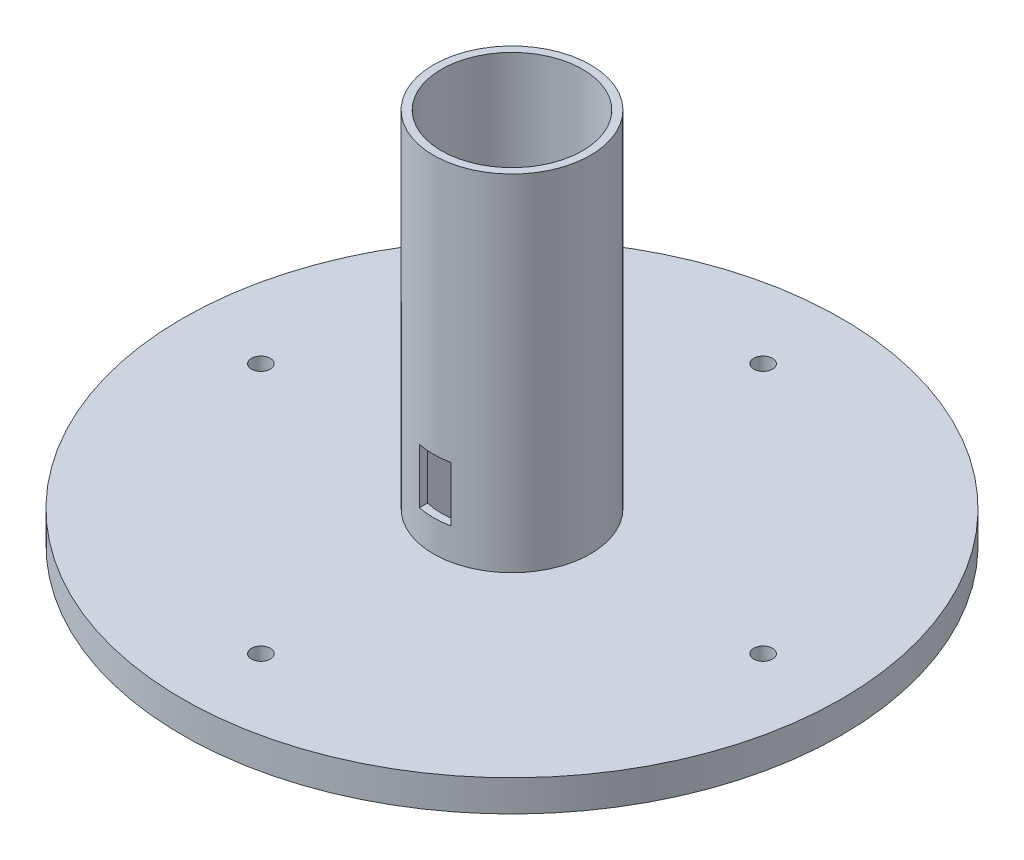
ISO-10303-21;
HEADER;
FILE_DESCRIPTION(('STEP AP214'),'2;1');
FILE_NAME('part.step','',(''),(''),'','','');
FILE_SCHEMA(('AUTOMOTIVE_DESIGN { 1 0 10303 214 1 1 1 1 }'));
ENDSEC;
DATA;
#1=APPLICATION_CONTEXT('core data for automotive mechanical design processes');
#2=APPLICATION_PROTOCOL_DEFINITION('international standard','automotive_design',2000,#1);
#3=PRODUCT_CONTEXT('',#1,'mechanical');
#4=PRODUCT('Part','Part','',(#3));
#5=PRODUCT_RELATED_PRODUCT_CATEGORY('part','',(#4));
#6=PRODUCT_DEFINITION_FORMATION('','',#4);
#7=PRODUCT_DEFINITION_CONTEXT('part definition',#1,'design');
#8=PRODUCT_DEFINITION('design','',#6,#7);
#9=PRODUCT_DEFINITION_SHAPE('','',#8);
#10=(LENGTH_UNIT() NAMED_UNIT(*) SI_UNIT(.MILLI.,.METRE.));
#11=(NAMED_UNIT(*) PLANE_ANGLE_UNIT() SI_UNIT($,.RADIAN.));
#12=(NAMED_UNIT(*) SI_UNIT($,.STERADIAN.) SOLID_ANGLE_UNIT());
#13=UNCERTAINTY_MEASURE_WITH_UNIT(LENGTH_MEASURE(1.E-05),#10,'distance_accuracy_value','');
#14=(GEOMETRIC_REPRESENTATION_CONTEXT(3) GLOBAL_UNCERTAINTY_ASSIGNED_CONTEXT((#13)) GLOBAL_UNIT_ASSIGNED_CONTEXT((#10,
#11,#12)) REPRESENTATION_CONTEXT('',''));
#15=CARTESIAN_POINT('',(0.,0.,0.));
#16=DIRECTION('',(0.,0.,1.));
#17=DIRECTION('',(1.,0.,0.));
#18=AXIS2_PLACEMENT_3D('',#15,#16,#17);
#19=CARTESIAN_POINT('',(31.75,-114.3,0.));
#20=DIRECTION('',(0.,-1.,0.));
#21=DIRECTION('',(1.,0.,0.));
#22=AXIS2_PLACEMENT_3D('',#19,#20,#21);
#23=PLANE('',#22);
#24=CARTESIAN_POINT('',(0.,-114.3,0.));
#25=DIRECTION('',(0.,-1.,0.));
#26=DIRECTION('',(1.,0.,0.));
#27=AXIS2_PLACEMENT_3D('',#24,#25,#26);
#28=CIRCLE('',#27,28.575);
#29=CARTESIAN_POINT('',(28.575,-114.3,0.));
#30=VERTEX_POINT('',#29);
#31=EDGE_CURVE('E119',#30,#30,#28,.T.);
#32=ORIENTED_EDGE('',*,*,#31,.T.);
#33=EDGE_LOOP('',(#32));
#34=FACE_BOUND('',#33,.T.);
#35=CARTESIAN_POINT('',(0.,-114.3,0.));
#36=DIRECTION('',(0.,1.,0.));
#37=DIRECTION('',(-1.,0.,0.));
#38=AXIS2_PLACEMENT_3D('',#35,#36,#37);
#39=CIRCLE('',#38,31.75);
#40=CARTESIAN_POINT('',(-31.75,-114.3,0.));
#41=VERTEX_POINT('',#40);
#42=EDGE_CURVE('E116',#41,#41,#39,.T.);
#43=ORIENTED_EDGE('',*,*,#42,.T.);
#44=EDGE_LOOP('',(#43));
#45=FACE_BOUND('',#44,.T.);
#46=ADVANCED_FACE('F41',(#34,#45),#23,.F.);
#47=CARTESIAN_POINT('',(0.,-279.4,0.));
#48=DIRECTION('',(0.,1.,0.));
#49=DIRECTION('',(-1.,0.,0.));
#50=AXIS2_PLACEMENT_3D('',#47,#48,#49);
#51=PLANE('',#50);
#52=CARTESIAN_POINT('',(0.,-279.4,0.));
#53=DIRECTION('',(0.,-1.,0.));
#54=DIRECTION('',(1.,0.,0.));
#55=AXIS2_PLACEMENT_3D('',#52,#53,#54);
#56=CIRCLE('',#55,28.575);
#57=CARTESIAN_POINT('',(28.575,-279.4,0.));
#58=VERTEX_POINT('',#57);
#59=EDGE_CURVE('E122',#58,#58,#56,.T.);
#60=ORIENTED_EDGE('',*,*,#59,.F.);
#61=EDGE_LOOP('',(#60));
#62=FACE_BOUND('',#61,.T.);
#63=CARTESIAN_POINT('',(0.,-279.4,0.));
#64=DIRECTION('',(0.,1.,0.));
#65=DIRECTION('',(-1.,0.,0.));
#66=AXIS2_PLACEMENT_3D('',#63,#64,#65);
#67=CIRCLE('',#66,31.75);
#68=CARTESIAN_POINT('',(-31.7499999999999,-279.4,0.));
#69=VERTEX_POINT('',#68);
#70=EDGE_CURVE('E84',#69,#69,#67,.T.);
#71=ORIENTED_EDGE('',*,*,#70,.F.);
#72=EDGE_LOOP('',(#71));
#73=FACE_BOUND('',#72,.T.);
#74=ADVANCED_FACE('F190',(#62,#73),#51,.F.);
#75=CARTESIAN_POINT('',(0.,0.,0.));
#76=DIRECTION('',(0.,1.,0.));
#77=DIRECTION('',(-1.,0.,0.));
#78=AXIS2_PLACEMENT_3D('',#75,#76,#77);
#79=CYLINDRICAL_SURFACE('',#78,31.75);
#80=CARTESIAN_POINT('',(0.,-266.7,0.));
#81=DIRECTION('',(0.,1.,0.));
#82=DIRECTION('',(-1.,0.,0.));
#83=AXIS2_PLACEMENT_3D('',#80,#81,#82);
#84=CIRCLE('',#83,31.75);
#85=CARTESIAN_POINT('',(-31.7499999999999,-266.7,0.));
#86=VERTEX_POINT('',#85);
#87=EDGE_CURVE('E104',#86,#86,#84,.T.);
#88=ORIENTED_EDGE('',*,*,#87,.F.);
#89=EDGE_LOOP('',(#88));
#90=FACE_BOUND('',#89,.T.);
#91=ORIENTED_EDGE('',*,*,#70,.T.);
#92=EDGE_LOOP('',(#91));
#93=FACE_BOUND('',#92,.T.);
#94=ADVANCED_FACE('F176',(#90,#93),#79,.T.);
#95=CARTESIAN_POINT('',(31.75,-266.7,0.));
#96=DIRECTION('',(0.,1.,0.));
#97=DIRECTION('',(-1.,0.,0.));
#98=AXIS2_PLACEMENT_3D('',#95,#96,#97);
#99=PLANE('',#98);
#100=CARTESIAN_POINT('',(0.,-266.7,101.6));
#101=DIRECTION('',(0.,-1.,0.));
#102=DIRECTION('',(1.,0.,0.));
#103=AXIS2_PLACEMENT_3D('',#100,#101,#102);
#104=CIRCLE('',#103,3.81);
#105=CARTESIAN_POINT('',(3.81000000000003,-266.7,101.6));
#106=VERTEX_POINT('',#105);
#107=EDGE_CURVE('E156',#106,#106,#104,.T.);
#108=ORIENTED_EDGE('',*,*,#107,.F.);
#109=EDGE_LOOP('',(#108));
#110=FACE_BOUND('',#109,.T.);
#111=CARTESIAN_POINT('',(101.6,-266.7,7.38124839028131E-13));
#112=DIRECTION('',(0.,-1.,0.));
#113=DIRECTION('',(1.,0.,0.));
#114=AXIS2_PLACEMENT_3D('',#111,#112,#113);
#115=CIRCLE('',#114,3.81);
#116=CARTESIAN_POINT('',(105.41,-266.7,7.38124839028131E-13));
#117=VERTEX_POINT('',#116);
#118=EDGE_CURVE('E153',#117,#117,#115,.T.);
#119=ORIENTED_EDGE('',*,*,#118,.F.);
#120=EDGE_LOOP('',(#119));
#121=FACE_BOUND('',#120,.T.);
#122=CARTESIAN_POINT('',(-3.02140300730264E-13,-266.7,-101.6));
#123=DIRECTION('',(0.,-1.,0.));
#124=DIRECTION('',(1.,0.,0.));
#125=AXIS2_PLACEMENT_3D('',#122,#123,#124);
#126=CIRCLE('',#125,3.81);
#127=CARTESIAN_POINT('',(3.8099999999997,-266.7,-101.6));
#128=VERTEX_POINT('',#127);
#129=EDGE_CURVE('E147',#128,#128,#126,.T.);
#130=ORIENTED_EDGE('',*,*,#129,.F.);
#131=EDGE_LOOP('',(#130));
#132=FACE_BOUND('',#131,.T.);
#133=CARTESIAN_POINT('',(-101.6,-266.7,0.));
#134=DIRECTION('',(0.,-1.,0.));
#135=DIRECTION('',(1.,0.,0.));
#136=AXIS2_PLACEMENT_3D('',#133,#134,#135);
#137=CIRCLE('',#136,3.81000000000001);
#138=CARTESIAN_POINT('',(-97.7900000000003,-266.7,0.));
#139=VERTEX_POINT('',#138);
#140=EDGE_CURVE('E141',#139,#139,#137,.T.);
#141=ORIENTED_EDGE('',*,*,#140,.F.);
#142=EDGE_LOOP('',(#141));
#143=FACE_BOUND('',#142,.T.);
#144=CARTESIAN_POINT('',(0.,-266.7,0.));
#145=DIRECTION('',(0.,1.,0.));
#146=DIRECTION('',(-1.,0.,0.));
#147=AXIS2_PLACEMENT_3D('',#144,#145,#146);
#148=CIRCLE('',#147,133.35);
#149=CARTESIAN_POINT('',(-133.35,-266.7,0.));
#150=VERTEX_POINT('',#149);
#151=EDGE_CURVE('E107',#150,#150,#148,.T.);
#152=ORIENTED_EDGE('',*,*,#151,.F.);
#153=EDGE_LOOP('',(#152));
#154=FACE_BOUND('',#153,.T.);
#155=ORIENTED_EDGE('',*,*,#87,.T.);
#156=EDGE_LOOP('',(#155));
#157=FACE_BOUND('',#156,.T.);
#158=ADVANCED_FACE('F172',(#110,#121,#132,#143,#154,#157),#99,.F.);
#159=CARTESIAN_POINT('',(0.,0.,0.));
#160=DIRECTION('',(0.,1.,0.));
#161=DIRECTION('',(-1.,0.,0.));
#162=AXIS2_PLACEMENT_3D('',#159,#160,#161);
#163=CYLINDRICAL_SURFACE('',#162,133.35);
#164=CARTESIAN_POINT('',(0.,-254.,0.));
#165=DIRECTION('',(0.,1.,0.));
#166=DIRECTION('',(-1.,0.,0.));
#167=AXIS2_PLACEMENT_3D('',#164,#165,#166);
#168=CIRCLE('',#167,133.35);
#169=CARTESIAN_POINT('',(-133.35,-254.,0.));
#170=VERTEX_POINT('',#169);
#171=EDGE_CURVE('E110',#170,#170,#168,.T.);
#172=ORIENTED_EDGE('',*,*,#171,.F.);
#173=EDGE_LOOP('',(#172));
#174=FACE_BOUND('',#173,.T.);
#175=ORIENTED_EDGE('',*,*,#151,.T.);
#176=EDGE_LOOP('',(#175));
#177=FACE_BOUND('',#176,.T.);
#178=ADVANCED_FACE('F175',(#174,#177),#163,.T.);
#179=CARTESIAN_POINT('',(31.75,-254.,0.));
#180=DIRECTION('',(0.,-1.,0.));
#181=DIRECTION('',(1.,0.,0.));
#182=AXIS2_PLACEMENT_3D('',#179,#180,#181);
#183=PLANE('',#182);
#184=CARTESIAN_POINT('',(0.,-254.,101.6));
#185=DIRECTION('',(0.,-1.,0.));
#186=DIRECTION('',(1.,0.,0.));
#187=AXIS2_PLACEMENT_3D('',#184,#185,#186);
#188=CIRCLE('',#187,3.81);
#189=CARTESIAN_POINT('',(3.81000000000003,-254.,101.6));
#190=VERTEX_POINT('',#189);
#191=EDGE_CURVE('E92',#190,#190,#188,.T.);
#192=ORIENTED_EDGE('',*,*,#191,.T.);
#193=EDGE_LOOP('',(#192));
#194=FACE_BOUND('',#193,.T.);
#195=CARTESIAN_POINT('',(101.6,-254.,7.38124839028131E-13));
#196=DIRECTION('',(0.,-1.,0.));
#197=DIRECTION('',(1.,0.,0.));
#198=AXIS2_PLACEMENT_3D('',#195,#196,#197);
#199=CIRCLE('',#198,3.81);
#200=CARTESIAN_POINT('',(105.41,-254.,7.38124839028131E-13));
#201=VERTEX_POINT('',#200);
#202=EDGE_CURVE('E150',#201,#201,#199,.T.);
#203=ORIENTED_EDGE('',*,*,#202,.T.);
#204=EDGE_LOOP('',(#203));
#205=FACE_BOUND('',#204,.T.);
#206=CARTESIAN_POINT('',(-3.03695602165181E-13,-254.,-101.6));
#207=DIRECTION('',(0.,-1.,0.));
#208=DIRECTION('',(1.,0.,0.));
#209=AXIS2_PLACEMENT_3D('',#206,#207,#208);
#210=CIRCLE('',#209,3.81);
#211=CARTESIAN_POINT('',(3.8099999999997,-254.,-101.6));
#212=VERTEX_POINT('',#211);
#213=EDGE_CURVE('E144',#212,#212,#210,.T.);
#214=ORIENTED_EDGE('',*,*,#213,.T.);
#215=EDGE_LOOP('',(#214));
#216=FACE_BOUND('',#215,.T.);
#217=CARTESIAN_POINT('',(-101.6,-254.,0.));
#218=DIRECTION('',(0.,-1.,0.));
#219=DIRECTION('',(1.,0.,0.));
#220=AXIS2_PLACEMENT_3D('',#217,#218,#219);
#221=CIRCLE('',#220,3.81000000000001);
#222=CARTESIAN_POINT('',(-97.7900000000003,-254.,0.));
#223=VERTEX_POINT('',#222);
#224=EDGE_CURVE('E138',#223,#223,#221,.T.);
#225=ORIENTED_EDGE('',*,*,#224,.T.);
#226=EDGE_LOOP('',(#225));
#227=FACE_BOUND('',#226,.T.);
#228=CARTESIAN_POINT('',(0.,-254.,0.));
#229=DIRECTION('',(0.,1.,0.));
#230=DIRECTION('',(-1.,0.,0.));
#231=AXIS2_PLACEMENT_3D('',#228,#229,#230);
#232=CIRCLE('',#231,31.75);
#233=CARTESIAN_POINT('',(-31.75,-254.,0.));
#234=VERTEX_POINT('',#233);
#235=EDGE_CURVE('E113',#234,#234,#232,.T.);
#236=ORIENTED_EDGE('',*,*,#235,.F.);
#237=EDGE_LOOP('',(#236));
#238=FACE_BOUND('',#237,.T.);
#239=ORIENTED_EDGE('',*,*,#171,.T.);
#240=EDGE_LOOP('',(#239));
#241=FACE_BOUND('',#240,.T.);
#242=ADVANCED_FACE('F162',(#194,#205,#216,#227,#238,#241),#183,.F.);
#243=CARTESIAN_POINT('',(0.,0.,0.));
#244=DIRECTION('',(0.,1.,0.));
#245=DIRECTION('',(-1.,0.,0.));
#246=AXIS2_PLACEMENT_3D('',#243,#244,#245);
#247=CYLINDRICAL_SURFACE('',#246,31.75);
#248=CARTESIAN_POINT('',(0.,-219.075,0.));
#249=DIRECTION('',(0.,1.,0.));
#250=DIRECTION('',(0.,0.,1.));
#251=AXIS2_PLACEMENT_3D('',#248,#249,#250);
#252=CIRCLE('',#251,31.75);
#253=CARTESIAN_POINT('',(-6.35,-219.075,31.1085197333464));
#254=VERTEX_POINT('',#253);
#255=CARTESIAN_POINT('',(6.35,-219.075,31.1085197333464));
#256=VERTEX_POINT('',#255);
#257=EDGE_CURVE('E90',#254,#256,#252,.T.);
#258=ORIENTED_EDGE('',*,*,#257,.T.);
#259=DIRECTION('',(0.,1.,0.));
#260=VECTOR('',#259,1.);
#261=CARTESIAN_POINT('',(6.34999999999997,0.,31.1085197333464));
#262=LINE('',#261,#260);
#263=CARTESIAN_POINT('',(6.35,-241.3,31.1085197333464));
#264=VERTEX_POINT('',#263);
#265=EDGE_CURVE('E126',#256,#264,#262,.F.);
#266=ORIENTED_EDGE('',*,*,#265,.T.);
#267=CARTESIAN_POINT('',(0.,-241.3,0.));
#268=DIRECTION('',(0.,-1.,0.));
#269=DIRECTION('',(0.,0.,-1.));
#270=AXIS2_PLACEMENT_3D('',#267,#268,#269);
#271=CIRCLE('',#270,31.75);
#272=CARTESIAN_POINT('',(-6.35,-241.3,31.1085197333464));
#273=VERTEX_POINT('',#272);
#274=EDGE_CURVE('E129',#264,#273,#271,.T.);
#275=ORIENTED_EDGE('',*,*,#274,.T.);
#276=DIRECTION('',(0.,1.,0.));
#277=VECTOR('',#276,1.);
#278=CARTESIAN_POINT('',(-6.35,0.,31.1085197333464));
#279=LINE('',#278,#277);
#280=EDGE_CURVE('E131',#273,#254,#279,.T.);
#281=ORIENTED_EDGE('',*,*,#280,.T.);
#282=EDGE_LOOP('',(#258,#266,#275,#281));
#283=FACE_BOUND('',#282,.T.);
#284=ORIENTED_EDGE('',*,*,#42,.F.);
#285=EDGE_LOOP('',(#284));
#286=FACE_BOUND('',#285,.T.);
#287=ORIENTED_EDGE('',*,*,#235,.T.);
#288=EDGE_LOOP('',(#287));
#289=FACE_BOUND('',#288,.T.);
#290=ADVANCED_FACE('F206',(#283,#286,#289),#247,.T.);
#291=CARTESIAN_POINT('',(0.,-50.8000000000002,0.));
#292=DIRECTION('',(0.,-1.,0.));
#293=DIRECTION('',(1.,0.,0.));
#294=AXIS2_PLACEMENT_3D('',#291,#292,#293);
#295=CYLINDRICAL_SURFACE('',#294,28.575);
#296=DIRECTION('',(0.,-1.,0.));
#297=VECTOR('',#296,1.);
#298=CARTESIAN_POINT('',(6.34999999999998,-50.8000000000002,27.86051192997));
#299=LINE('',#298,#297);
#300=CARTESIAN_POINT('',(6.35,-241.3,27.86051192997));
#301=VERTEX_POINT('',#300);
#302=CARTESIAN_POINT('',(6.35,-219.075,27.86051192997));
#303=VERTEX_POINT('',#302);
#304=EDGE_CURVE('E48',#301,#303,#299,.F.);
#305=ORIENTED_EDGE('',*,*,#304,.T.);
#306=CARTESIAN_POINT('',(0.,-219.075,0.));
#307=DIRECTION('',(0.,1.,0.));
#308=DIRECTION('',(0.,0.,1.));
#309=AXIS2_PLACEMENT_3D('',#306,#307,#308);
#310=CIRCLE('',#309,28.575);
#311=CARTESIAN_POINT('',(-6.35,-219.075,27.86051192997));
#312=VERTEX_POINT('',#311);
#313=EDGE_CURVE('E11',#303,#312,#310,.F.);
#314=ORIENTED_EDGE('',*,*,#313,.T.);
#315=DIRECTION('',(0.,-1.,0.));
#316=VECTOR('',#315,1.);
#317=CARTESIAN_POINT('',(-6.35,-50.8000000000002,27.86051192997));
#318=LINE('',#317,#316);
#319=CARTESIAN_POINT('',(-6.34999999999998,-241.3,27.86051192997));
#320=VERTEX_POINT('',#319);
#321=EDGE_CURVE('E79',#312,#320,#318,.T.);
#322=ORIENTED_EDGE('',*,*,#321,.T.);
#323=CARTESIAN_POINT('',(0.,-241.3,0.));
#324=DIRECTION('',(0.,-1.,0.));
#325=DIRECTION('',(0.,0.,-1.));
#326=AXIS2_PLACEMENT_3D('',#323,#324,#325);
#327=CIRCLE('',#326,28.575);
#328=EDGE_CURVE('E83',#320,#301,#327,.F.);
#329=ORIENTED_EDGE('',*,*,#328,.T.);
#330=EDGE_LOOP('',(#305,#314,#322,#329));
#331=FACE_BOUND('',#330,.T.);
#332=ORIENTED_EDGE('',*,*,#59,.T.);
#333=EDGE_LOOP('',(#332));
#334=FACE_BOUND('',#333,.T.);
#335=ORIENTED_EDGE('',*,*,#31,.F.);
#336=EDGE_LOOP('',(#335));
#337=FACE_BOUND('',#336,.T.);
#338=ADVANCED_FACE('F95',(#331,#334,#337),#295,.F.);
#339=CARTESIAN_POINT('',(0.,-219.075,22.86));
#340=DIRECTION('',(0.,1.,0.));
#341=DIRECTION('',(0.,0.,1.));
#342=AXIS2_PLACEMENT_3D('',#339,#340,#341);
#343=PLANE('',#342);
#344=ORIENTED_EDGE('',*,*,#257,.F.);
#345=DIRECTION('',(0.,0.,1.));
#346=VECTOR('',#345,1.);
#347=CARTESIAN_POINT('',(-6.35,-219.075,22.86));
#348=LINE('',#347,#346);
#349=EDGE_CURVE('E55',#312,#254,#348,.T.);
#350=ORIENTED_EDGE('',*,*,#349,.F.);
#351=ORIENTED_EDGE('',*,*,#313,.F.);
#352=DIRECTION('',(0.,0.,1.));
#353=VECTOR('',#352,1.);
#354=CARTESIAN_POINT('',(6.35,-219.075,22.86));
#355=LINE('',#354,#353);
#356=EDGE_CURVE('E132',#303,#256,#355,.T.);
#357=ORIENTED_EDGE('',*,*,#356,.T.);
#358=EDGE_LOOP('',(#344,#350,#351,#357));
#359=FACE_BOUND('',#358,.T.);
#360=ADVANCED_FACE('F87',(#359),#343,.F.);
#361=CARTESIAN_POINT('',(6.35,-219.075,22.86));
#362=DIRECTION('',(1.,0.,0.));
#363=DIRECTION('',(0.,1.,0.));
#364=AXIS2_PLACEMENT_3D('',#361,#362,#363);
#365=PLANE('',#364);
#366=ORIENTED_EDGE('',*,*,#356,.F.);
#367=ORIENTED_EDGE('',*,*,#304,.F.);
#368=DIRECTION('',(0.,0.,1.));
#369=VECTOR('',#368,1.);
#370=CARTESIAN_POINT('',(6.35,-241.3,22.86));
#371=LINE('',#370,#369);
#372=EDGE_CURVE('E135',#301,#264,#371,.T.);
#373=ORIENTED_EDGE('',*,*,#372,.T.);
#374=ORIENTED_EDGE('',*,*,#265,.F.);
#375=EDGE_LOOP('',(#366,#367,#373,#374));
#376=FACE_BOUND('',#375,.T.);
#377=ADVANCED_FACE('F218',(#376),#365,.F.);
#378=CARTESIAN_POINT('',(-6.35,-241.3,22.86));
#379=DIRECTION('',(0.,-1.,0.));
#380=DIRECTION('',(0.,0.,-1.));
#381=AXIS2_PLACEMENT_3D('',#378,#379,#380);
#382=PLANE('',#381);
#383=ORIENTED_EDGE('',*,*,#372,.F.);
#384=ORIENTED_EDGE('',*,*,#328,.F.);
#385=DIRECTION('',(0.,0.,1.));
#386=VECTOR('',#385,1.);
#387=CARTESIAN_POINT('',(-6.35,-241.3,22.86));
#388=LINE('',#387,#386);
#389=EDGE_CURVE('E60',#320,#273,#388,.T.);
#390=ORIENTED_EDGE('',*,*,#389,.T.);
#391=ORIENTED_EDGE('',*,*,#274,.F.);
#392=EDGE_LOOP('',(#383,#384,#390,#391));
#393=FACE_BOUND('',#392,.T.);
#394=ADVANCED_FACE('F215',(#393),#382,.F.);
#395=CARTESIAN_POINT('',(-6.35,-241.3,22.86));
#396=DIRECTION('',(-1.,0.,0.));
#397=DIRECTION('',(0.,0.,1.));
#398=AXIS2_PLACEMENT_3D('',#395,#396,#397);
#399=PLANE('',#398);
#400=ORIENTED_EDGE('',*,*,#389,.F.);
#401=ORIENTED_EDGE('',*,*,#321,.F.);
#402=ORIENTED_EDGE('',*,*,#349,.T.);
#403=ORIENTED_EDGE('',*,*,#280,.F.);
#404=EDGE_LOOP('',(#400,#401,#402,#403));
#405=FACE_BOUND('',#404,.T.);
#406=ADVANCED_FACE('F80',(#405),#399,.F.);
#407=CARTESIAN_POINT('',(-101.6,-254.,0.));
#408=DIRECTION('',(0.,-1.,0.));
#409=DIRECTION('',(1.,0.,0.));
#410=AXIS2_PLACEMENT_3D('',#407,#408,#409);
#411=CYLINDRICAL_SURFACE('',#410,3.81000000000001);
#412=ORIENTED_EDGE('',*,*,#224,.F.);
#413=EDGE_LOOP('',(#412));
#414=FACE_BOUND('',#413,.T.);
#415=ORIENTED_EDGE('',*,*,#140,.T.);
#416=EDGE_LOOP('',(#415));
#417=FACE_BOUND('',#416,.T.);
#418=ADVANCED_FACE('F214',(#414,#417),#411,.F.);
#419=CARTESIAN_POINT('',(-3.03695602165181E-13,-254.,-101.6));
#420=DIRECTION('',(0.,-1.,0.));
#421=DIRECTION('',(1.,0.,0.));
#422=AXIS2_PLACEMENT_3D('',#419,#420,#421);
#423=CYLINDRICAL_SURFACE('',#422,3.81);
#424=ORIENTED_EDGE('',*,*,#213,.F.);
#425=EDGE_LOOP('',(#424));
#426=FACE_BOUND('',#425,.T.);
#427=ORIENTED_EDGE('',*,*,#129,.T.);
#428=EDGE_LOOP('',(#427));
#429=FACE_BOUND('',#428,.T.);
#430=ADVANCED_FACE('F226',(#426,#429),#423,.F.);
#431=CARTESIAN_POINT('',(101.6,-254.,7.38124839028131E-13));
#432=DIRECTION('',(0.,-1.,0.));
#433=DIRECTION('',(1.,0.,0.));
#434=AXIS2_PLACEMENT_3D('',#431,#432,#433);
#435=CYLINDRICAL_SURFACE('',#434,3.81);
#436=ORIENTED_EDGE('',*,*,#202,.F.);
#437=EDGE_LOOP('',(#436));
#438=FACE_BOUND('',#437,.T.);
#439=ORIENTED_EDGE('',*,*,#118,.T.);
#440=EDGE_LOOP('',(#439));
#441=FACE_BOUND('',#440,.T.);
#442=ADVANCED_FACE('F168',(#438,#441),#435,.F.);
#443=CARTESIAN_POINT('',(0.,-254.,101.6));
#444=DIRECTION('',(0.,-1.,0.));
#445=DIRECTION('',(1.,0.,0.));
#446=AXIS2_PLACEMENT_3D('',#443,#444,#445);
#447=CYLINDRICAL_SURFACE('',#446,3.81);
#448=ORIENTED_EDGE('',*,*,#191,.F.);
#449=EDGE_LOOP('',(#448));
#450=FACE_BOUND('',#449,.T.);
#451=ORIENTED_EDGE('',*,*,#107,.T.);
#452=EDGE_LOOP('',(#451));
#453=FACE_BOUND('',#452,.T.);
#454=ADVANCED_FACE('F165',(#450,#453),#447,.F.);
#455=CLOSED_SHELL('',(#46,#74,#94,#158,#178,#242,#290,#338,#360,#377,#394,#406,#418,#430,#442,#454));
#456=MANIFOLD_SOLID_BREP('B2',#455);
#457=ADVANCED_BREP_SHAPE_REPRESENTATION('',(#18,#456),#14);
#458=SHAPE_DEFINITION_REPRESENTATION(#9,#457);
ENDSEC;
END-ISO-10303-21;
